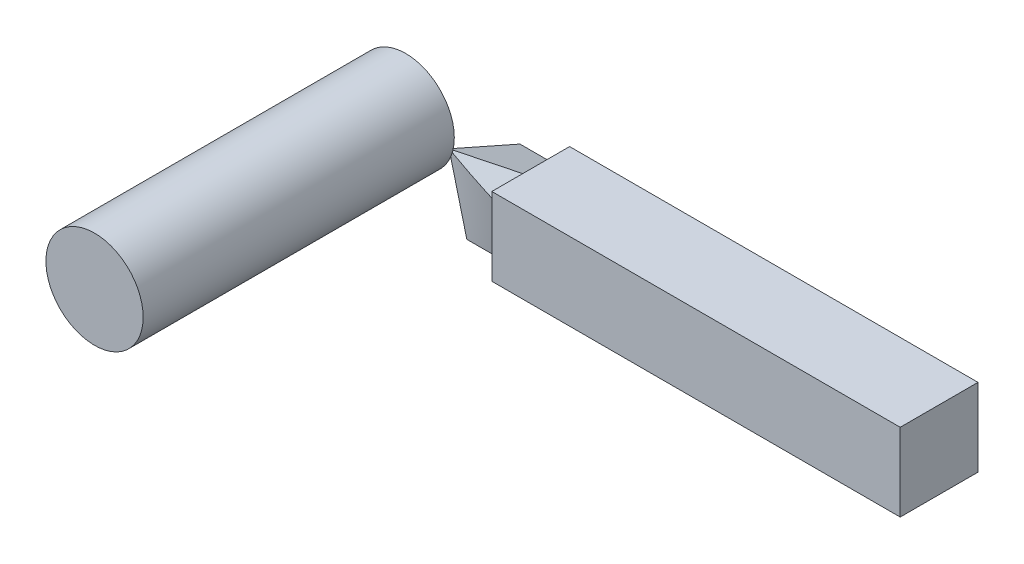
ISO-10303-21;
HEADER;
FILE_DESCRIPTION(('STEP AP214'),'2;1');
FILE_NAME('part.step','',(''),(''),'','','');
FILE_SCHEMA(('AUTOMOTIVE_DESIGN { 1 0 10303 214 1 1 1 1 }'));
ENDSEC;
DATA;
#1=APPLICATION_CONTEXT('core data for automotive mechanical design processes');
#2=APPLICATION_PROTOCOL_DEFINITION('international standard','automotive_design',2000,#1);
#3=PRODUCT_CONTEXT('',#1,'mechanical');
#4=PRODUCT('Part','Part','',(#3));
#5=PRODUCT_RELATED_PRODUCT_CATEGORY('part','',(#4));
#6=PRODUCT_DEFINITION_FORMATION('','',#4);
#7=PRODUCT_DEFINITION_CONTEXT('part definition',#1,'design');
#8=PRODUCT_DEFINITION('design','',#6,#7);
#9=PRODUCT_DEFINITION_SHAPE('','',#8);
#10=(LENGTH_UNIT() NAMED_UNIT(*) SI_UNIT(.MILLI.,.METRE.));
#11=(NAMED_UNIT(*) PLANE_ANGLE_UNIT() SI_UNIT($,.RADIAN.));
#12=(NAMED_UNIT(*) SI_UNIT($,.STERADIAN.) SOLID_ANGLE_UNIT());
#13=UNCERTAINTY_MEASURE_WITH_UNIT(LENGTH_MEASURE(1.E-05),#10,'distance_accuracy_value','');
#14=(GEOMETRIC_REPRESENTATION_CONTEXT(3) GLOBAL_UNCERTAINTY_ASSIGNED_CONTEXT((#13)) GLOBAL_UNIT_ASSIGNED_CONTEXT((#10,
#11,#12)) REPRESENTATION_CONTEXT('',''));
#15=CARTESIAN_POINT('',(0.,0.,0.));
#16=DIRECTION('',(0.,0.,1.));
#17=DIRECTION('',(1.,0.,0.));
#18=AXIS2_PLACEMENT_3D('',#15,#16,#17);
#19=CARTESIAN_POINT('',(-10.5297273001142,13.7765604667373,86.6108000747772));
#20=DIRECTION('',(0.,0.,-1.));
#21=DIRECTION('',(-1.,0.,0.));
#22=AXIS2_PLACEMENT_3D('',#19,#20,#21);
#23=CYLINDRICAL_SURFACE('',#22,12.5);
#24=CARTESIAN_POINT('',(-10.5297273001142,13.7765604667373,86.6108000747772));
#25=DIRECTION('',(0.,0.,1.));
#26=DIRECTION('',(1.,0.,0.));
#27=AXIS2_PLACEMENT_3D('',#24,#25,#26);
#28=CIRCLE('',#27,12.5);
#29=CARTESIAN_POINT('',(1.97027269988581,13.7765604667373,86.6108000747772));
#30=VERTEX_POINT('',#29);
#31=EDGE_CURVE('E12',#30,#30,#28,.T.);
#32=ORIENTED_EDGE('',*,*,#31,.F.);
#33=EDGE_LOOP('',(#32));
#34=FACE_BOUND('',#33,.T.);
#35=CARTESIAN_POINT('',(-10.5297273001142,13.7765604667373,6.61080007477721));
#36=DIRECTION('',(0.,0.,1.));
#37=DIRECTION('',(1.,0.,0.));
#38=AXIS2_PLACEMENT_3D('',#35,#36,#37);
#39=CIRCLE('',#38,12.5);
#40=CARTESIAN_POINT('',(1.97027269988581,13.7765604667373,6.61080007477721));
#41=VERTEX_POINT('',#40);
#42=EDGE_CURVE('E368',#41,#41,#39,.T.);
#43=ORIENTED_EDGE('',*,*,#42,.T.);
#44=EDGE_LOOP('',(#43));
#45=FACE_BOUND('',#44,.T.);
#46=ADVANCED_FACE('F362',(#34,#45),#23,.T.);
#47=CARTESIAN_POINT('',(-10.5297273001142,13.7765604667373,86.6108000747772));
#48=DIRECTION('',(0.,0.,1.));
#49=DIRECTION('',(1.,0.,0.));
#50=AXIS2_PLACEMENT_3D('',#47,#48,#49);
#51=PLANE('',#50);
#52=ORIENTED_EDGE('',*,*,#31,.T.);
#53=EDGE_LOOP('',(#52));
#54=FACE_BOUND('',#53,.T.);
#55=ADVANCED_FACE('F379',(#54),#51,.T.);
#56=CARTESIAN_POINT('',(-10.5297273001142,13.7765604667373,6.61080007477721));
#57=DIRECTION('',(0.,0.,1.));
#58=DIRECTION('',(1.,0.,0.));
#59=AXIS2_PLACEMENT_3D('',#56,#57,#58);
#60=PLANE('',#59);
#61=ORIENTED_EDGE('',*,*,#42,.F.);
#62=EDGE_LOOP('',(#61));
#63=FACE_BOUND('',#62,.T.);
#64=ADVANCED_FACE('F377',(#63),#60,.F.);
#65=CLOSED_SHELL('',(#46,#55,#64));
#66=MANIFOLD_SOLID_BREP('B2',#65);
#67=CARTESIAN_POINT('',(1.71010071662828,9.69846310392957,-14.));
#68=DIRECTION('',(-0.173648177666923,-0.984807753012209,0.));
#69=DIRECTION('',(0.984807753012209,-0.173648177666923,0.));
#70=AXIS2_PLACEMENT_3D('',#67,#68,#69);
#71=PLANE('',#70);
#72=DIRECTION('',(0.888831911434334,-0.156725047300543,-0.430598528521209));
#73=VECTOR('',#72,1.);
#74=CARTESIAN_POINT('',(9.04025358617476,8.405959380311,1.60117150524408));
#75=LINE('',#74,#73);
#76=CARTESIAN_POINT('',(0.244235743587722,9.95693464875209,5.86244103341864));
#77=VERTEX_POINT('',#76);
#78=CARTESIAN_POINT('',(15.,7.35509528937313,-1.28605385552347));
#79=VERTEX_POINT('',#78);
#80=EDGE_CURVE('E413',#77,#79,#75,.T.);
#81=ORIENTED_EDGE('',*,*,#80,.F.);
#82=CARTESIAN_POINT('',(0.890718421846029,9.84294231001449,5.39120845102225));
#83=DIRECTION('',(-0.173648177666923,-0.984807753012209,0.));
#84=DIRECTION('',(-0.984807753012209,0.173648177666923,0.));
#85=AXIS2_PLACEMENT_3D('',#82,#83,#84);
#86=ELLIPSE('',#85,0.812341289508596,0.800000000000001);
#87=CARTESIAN_POINT('',(0.546298910514158,9.90367276254304,6.11327160630295));
#88=VERTEX_POINT('',#87);
#89=EDGE_CURVE('E487',#77,#88,#86,.F.);
#90=ORIENTED_EDGE('',*,*,#89,.T.);
#91=CARTESIAN_POINT('',(0.,10.,5.98076211353315));
#92=CARTESIAN_POINT('',(2.48379016056383,9.5620407802744,6.5858434514635));
#93=CARTESIAN_POINT('',(4.97556164326945,9.12267423811348,7.15711457958157));
#94=CARTESIAN_POINT('',(8.72520560673307,8.46151083930425,7.96046392769599));
#95=CARTESIAN_POINT('',(9.9775290237809,8.24069243230571,8.21940278050777));
#96=CARTESIAN_POINT('',(12.4859982007925,7.79838163612302,8.718885307571));
#97=CARTESIAN_POINT('',(13.7421447021791,7.57688911620603,8.9594251413064));
#98=CARTESIAN_POINT('',(15.,7.35509528937313,9.19048425208671));
#99=B_SPLINE_CURVE_WITH_KNOTS('',3,(#91,#92,#93,#94,#95,#96,#97,#98),.UNSPECIFIED.,.F.,.F.,(4,2,
2,4),(0.,7.78068248414817,11.6737739462897,15.5676758271091),.UNSPECIFIED.);
#100=CARTESIAN_POINT('',(15.,7.35509528937313,9.19048425208671));
#101=VERTEX_POINT('',#100);
#102=EDGE_CURVE('E500',#88,#101,#99,.T.);
#103=ORIENTED_EDGE('',*,*,#102,.T.);
#104=DIRECTION('',(0.,0.,1.));
#105=VECTOR('',#104,1.);
#106=CARTESIAN_POINT('',(15.,7.35509528937313,-14.));
#107=LINE('',#106,#105);
#108=EDGE_CURVE('E575',#79,#101,#107,.T.);
#109=ORIENTED_EDGE('',*,*,#108,.F.);
#110=EDGE_LOOP('',(#81,#90,#103,#109));
#111=FACE_BOUND('',#110,.T.);
#112=ADVANCED_FACE('F407',(#111),#71,.F.);
#113=CARTESIAN_POINT('',(120.,-10.,-10.));
#114=DIRECTION('',(0.,0.,1.));
#115=DIRECTION('',(1.,0.,0.));
#116=AXIS2_PLACEMENT_3D('',#113,#114,#115);
#117=PLANE('',#116);
#118=DIRECTION('',(-1.,0.,0.));
#119=VECTOR('',#118,1.);
#120=CARTESIAN_POINT('',(15.,4.18347826978496,-9.99999999999999));
#121=LINE('',#120,#119);
#122=CARTESIAN_POINT('',(15.,4.183478269785,-9.99999999999999));
#123=VERTEX_POINT('',#122);
#124=CARTESIAN_POINT('',(2.2459496466162,4.18347826978497,-10.));
#125=VERTEX_POINT('',#124);
#126=EDGE_CURVE('E555',#123,#125,#121,.T.);
#127=ORIENTED_EDGE('',*,*,#126,.F.);
#128=DIRECTION('',(0.,-1.,0.));
#129=VECTOR('',#128,1.);
#130=CARTESIAN_POINT('',(15.,-10.,-10.));
#131=LINE('',#130,#129);
#132=CARTESIAN_POINT('',(15.,10.,-9.99999999999999));
#133=VERTEX_POINT('',#132);
#134=EDGE_CURVE('E560',#133,#123,#131,.T.);
#135=ORIENTED_EDGE('',*,*,#134,.F.);
#136=DIRECTION('',(-1.,0.,0.));
#137=VECTOR('',#136,1.);
#138=CARTESIAN_POINT('',(120.,10.,-10.));
#139=LINE('',#138,#137);
#140=CARTESIAN_POINT('',(120.,10.,-10.));
#141=VERTEX_POINT('',#140);
#142=EDGE_CURVE('E515',#141,#133,#139,.T.);
#143=ORIENTED_EDGE('',*,*,#142,.F.);
#144=DIRECTION('',(0.,1.,0.));
#145=VECTOR('',#144,1.);
#146=CARTESIAN_POINT('',(120.,-10.,-10.));
#147=LINE('',#146,#145);
#148=CARTESIAN_POINT('',(120.,-10.,-10.));
#149=VERTEX_POINT('',#148);
#150=EDGE_CURVE('E602',#149,#141,#147,.T.);
#151=ORIENTED_EDGE('',*,*,#150,.F.);
#152=DIRECTION('',(-1.,0.,0.));
#153=VECTOR('',#152,1.);
#154=CARTESIAN_POINT('',(120.,-10.,-10.));
#155=LINE('',#154,#153);
#156=CARTESIAN_POINT('',(2.4556912180581,-9.99999999999999,-9.99999999999999));
#157=VERTEX_POINT('',#156);
#158=EDGE_CURVE('E618',#149,#157,#155,.T.);
#159=ORIENTED_EDGE('',*,*,#158,.T.);
#160=DIRECTION('',(-0.121869343405148,0.992546151641322,0.));
#161=VECTOR('',#160,1.);
#162=CARTESIAN_POINT('',(4.20147537943691,-24.2182709987401,-10.));
#163=LINE('',#162,#161);
#164=CARTESIAN_POINT('',(2.2459496466162,-8.29179198182939,-9.99999999999999));
#165=VERTEX_POINT('',#164);
#166=EDGE_CURVE('E599',#157,#165,#163,.T.);
#167=ORIENTED_EDGE('',*,*,#166,.T.);
#168=DIRECTION('',(0.,1.,0.));
#169=VECTOR('',#168,1.);
#170=CARTESIAN_POINT('',(2.2459496466162,-110.,-10.));
#171=LINE('',#170,#169);
#172=EDGE_CURVE('E561',#165,#125,#171,.T.);
#173=ORIENTED_EDGE('',*,*,#172,.T.);
#174=EDGE_LOOP('',(#127,#135,#143,#151,#159,#167,#173));
#175=FACE_BOUND('',#174,.T.);
#176=ADVANCED_FACE('F412',(#175),#117,.F.);
#177=CARTESIAN_POINT('',(120.,-10.,10.));
#178=DIRECTION('',(0.,1.,0.));
#179=DIRECTION('',(0.,0.,1.));
#180=AXIS2_PLACEMENT_3D('',#177,#178,#179);
#181=PLANE('',#180);
#182=DIRECTION('',(0.,0.,1.));
#183=VECTOR('',#182,1.);
#184=CARTESIAN_POINT('',(2.4556912180581,-9.99999999999999,-110.));
#185=LINE('',#184,#183);
#186=CARTESIAN_POINT('',(2.45569121805811,-10.,3.87867740821986));
#187=VERTEX_POINT('',#186);
#188=EDGE_CURVE('E591',#157,#187,#185,.T.);
#189=ORIENTED_EDGE('',*,*,#188,.F.);
#190=ORIENTED_EDGE('',*,*,#158,.F.);
#191=DIRECTION('',(0.,0.,-1.));
#192=VECTOR('',#191,1.);
#193=CARTESIAN_POINT('',(120.,-10.,10.));
#194=LINE('',#193,#192);
#195=CARTESIAN_POINT('',(120.,-10.,10.));
#196=VERTEX_POINT('',#195);
#197=EDGE_CURVE('E429',#196,#149,#194,.T.);
#198=ORIENTED_EDGE('',*,*,#197,.F.);
#199=DIRECTION('',(-1.,0.,0.));
#200=VECTOR('',#199,1.);
#201=CARTESIAN_POINT('',(120.,-10.,10.));
#202=LINE('',#201,#200);
#203=CARTESIAN_POINT('',(15.,-10.,10.));
#204=VERTEX_POINT('',#203);
#205=EDGE_CURVE('E620',#196,#204,#202,.T.);
#206=ORIENTED_EDGE('',*,*,#205,.T.);
#207=DIRECTION('',(0.,0.,-1.));
#208=VECTOR('',#207,1.);
#209=CARTESIAN_POINT('',(15.,-10.,5.98076211353326));
#210=LINE('',#209,#208);
#211=CARTESIAN_POINT('',(15.,-9.99999999999999,3.87867740821987));
#212=VERTEX_POINT('',#211);
#213=EDGE_CURVE('E621',#204,#212,#210,.T.);
#214=ORIENTED_EDGE('',*,*,#213,.T.);
#215=DIRECTION('',(1.,0.,0.));
#216=VECTOR('',#215,1.);
#217=CARTESIAN_POINT('',(120.,-10.,3.87867740821987));
#218=LINE('',#217,#216);
#219=EDGE_CURVE('E630',#212,#187,#218,.F.);
#220=ORIENTED_EDGE('',*,*,#219,.T.);
#221=EDGE_LOOP('',(#189,#190,#198,#206,#214,#220));
#222=FACE_BOUND('',#221,.T.);
#223=ADVANCED_FACE('F542',(#222),#181,.F.);
#224=CARTESIAN_POINT('',(1.20960947799834,0.148521368620019,-110.));
#225=DIRECTION('',(0.992546151641322,0.121869343405148,0.));
#226=DIRECTION('',(-0.121869343405148,0.992546151641322,0.));
#227=AXIS2_PLACEMENT_3D('',#224,#225,#226);
#228=PLANE('',#227);
#229=DIRECTION('',(0.121211565739221,-0.98718898245743,-0.103757743063883));
#230=VECTOR('',#229,1.);
#231=CARTESIAN_POINT('',(2.65523533984181,-11.6251564554725,3.70786658178036));
#232=LINE('',#231,#230);
#233=CARTESIAN_POINT('',(0.205801296673087,8.32388294456803,5.80459511220634));
#234=VERTEX_POINT('',#233);
#235=EDGE_CURVE('E593',#234,#187,#232,.T.);
#236=ORIENTED_EDGE('',*,*,#235,.F.);
#237=CARTESIAN_POINT('',(0.890718421846022,2.74568060270721,5.39120845102237));
#238=DIRECTION('',(0.992546151641322,0.121869343405148,0.));
#239=DIRECTION('',(-0.121869343405148,0.992546151641322,0.));
#240=AXIS2_PLACEMENT_3D('',#237,#238,#239);
#241=ELLIPSE('',#240,6.56440723850003,0.8);
#242=CARTESIAN_POINT('',(0.0985039668527643,9.19774956942134,5.27986997025431));
#243=VERTEX_POINT('',#242);
#244=EDGE_CURVE('E489',#234,#243,#241,.F.);
#245=ORIENTED_EDGE('',*,*,#244,.T.);
#246=DIRECTION('',(0.0920735116700315,-0.749878575880894,-0.655137077170565));
#247=VECTOR('',#246,1.);
#248=CARTESIAN_POINT('',(8.64603864066889,-60.4163339192617,-55.5389994488492));
#249=LINE('',#248,#247);
#250=EDGE_CURVE('E597',#243,#165,#249,.T.);
#251=ORIENTED_EDGE('',*,*,#250,.T.);
#252=ORIENTED_EDGE('',*,*,#166,.F.);
#253=ORIENTED_EDGE('',*,*,#188,.T.);
#254=EDGE_LOOP('',(#236,#245,#251,#252,#253));
#255=FACE_BOUND('',#254,.T.);
#256=ADVANCED_FACE('F547',(#255),#228,.F.);
#257=CARTESIAN_POINT('',(0.890718421846022,-18.,5.39120845102237));
#258=DIRECTION('',(0.,1.,0.));
#259=DIRECTION('',(0.,0.,1.));
#260=AXIS2_PLACEMENT_3D('',#257,#258,#259);
#261=CYLINDRICAL_SURFACE('',#260,0.8);
#262=ORIENTED_EDGE('',*,*,#244,.F.);
#263=CARTESIAN_POINT('',(0.205801296673087,8.32388294456798,5.80459511220623));
#264=CARTESIAN_POINT('',(0.210413084149111,8.37173481120572,5.81223494159052));
#265=CARTESIAN_POINT('',(0.215237109390485,8.41955520371719,5.81994059987371));
#266=CARTESIAN_POINT('',(0.225367324244377,8.51512383322109,5.8354988960342));
#267=CARTESIAN_POINT('',(0.230673542900525,8.5628720656908,5.84335154274231));
#268=CARTESIAN_POINT('',(0.247409501021539,8.70605737663696,5.86716341859697));
#269=CARTESIAN_POINT('',(0.259649820223377,8.80136349352369,5.88336520648307));
#270=CARTESIAN_POINT('',(0.282644512578619,8.96091208313898,5.91126462272347));
#271=CARTESIAN_POINT('',(0.292614810357071,9.02530644936148,5.92273881432036));
#272=CARTESIAN_POINT('',(0.314274578003356,9.15370938424389,5.94615785015179));
#273=CARTESIAN_POINT('',(0.325963607882506,9.21771804728967,5.95810257336085));
#274=CARTESIAN_POINT('',(0.347602032849032,9.32494180466321,5.97872070407494));
#275=CARTESIAN_POINT('',(0.356927550047339,9.36831376999397,5.9872302567712));
#276=CARTESIAN_POINT('',(0.376985124929487,9.45465740447111,6.00460515080651));
#277=CARTESIAN_POINT('',(0.387716899781651,9.49762915225425,6.0134704203544));
#278=CARTESIAN_POINT('',(0.407457430798417,9.56965383078062,6.02883068393462));
#279=CARTESIAN_POINT('',(0.415960746819172,9.59887067203438,6.03520327300336));
#280=CARTESIAN_POINT('',(0.434140864566578,9.65685522668753,6.04821888791853));
#281=CARTESIAN_POINT('',(0.443816670542344,9.68562329809349,6.05486168114931));
#282=CARTESIAN_POINT('',(0.461585996500953,9.73383254663159,6.06642746030114));
#283=CARTESIAN_POINT('',(0.469264605418846,9.75344718992353,6.07125843593711));
#284=CARTESIAN_POINT('',(0.485650852906234,9.79223905508384,6.08114474349292));
#285=CARTESIAN_POINT('',(0.494360633873555,9.81141526388333,6.08620052838751));
#286=CARTESIAN_POINT('',(0.513823204026937,9.8503885636021,6.09695925931494));
#287=CARTESIAN_POINT('',(0.524677819410076,9.87013127021928,6.10268260381538));
#288=CARTESIAN_POINT('',(0.542683151362726,9.89852915132423,6.11156615881562));
#289=CARTESIAN_POINT('',(0.548959590914308,9.90777717715757,6.11457154097687));
#290=CARTESIAN_POINT('',(0.562235712815918,9.92569276506621,6.12069644744344));
#291=CARTESIAN_POINT('',(0.569235715951094,9.93436006685205,6.12381602197562));
#292=CARTESIAN_POINT('',(0.588677014099394,9.95585316458875,6.13211464525557));
#293=CARTESIAN_POINT('',(0.601861145976829,9.96804974405277,6.13740522950877));
#294=CARTESIAN_POINT('',(0.622830531428491,9.98208238612616,6.14505140284252));
#295=CARTESIAN_POINT('',(0.629340063734289,9.98583530636458,6.14733861257557));
#296=CARTESIAN_POINT('',(0.642900001159228,9.99217537046395,6.15189028909175));
#297=CARTESIAN_POINT('',(0.64994813992659,9.99476711490889,6.15415481024162));
#298=CARTESIAN_POINT('',(0.661492093698383,9.9977277338463,6.1576779125852));
#299=CARTESIAN_POINT('',(0.66585751011964,9.99857205535572,6.15897035458095));
#300=CARTESIAN_POINT('',(0.674697290223388,9.99971193970374,6.16150474761336));
#301=CARTESIAN_POINT('',(0.67917209104241,10.0000047245149,6.16274641238966));
#302=CARTESIAN_POINT('',(0.683663185763669,10.,6.16394911205342));
#303=B_SPLINE_CURVE_WITH_KNOTS('',3,(#263,#264,#265,#266,#267,#268,#269,#270,#271,#272,#273,
#274,#275,#276,#277,#278,#279,#280,#281,#282,#283,#284,#285,#286,#287,#288,#289,#290,#291,#292,
#293,#294,#295,#296,#297,#298,#299,#300,#301,#302),.UNSPECIFIED.,.F.,.F.,(4,2,2,2,2,2,2,2,2,2,2,
2,2,2,2,2,2,2,2,4),(0.,0.146028715120229,0.29206623172685,0.584359578899613,0.782835508191702,
0.981260716598987,1.1167598373421,1.25223174771562,1.34548144950654,1.43865250572127,
1.50346218576654,1.5684089609339,1.63802213118835,1.67270664553417,1.70740660342978,
1.76294921980601,1.78643529313741,1.80982747335104,1.82368673171861,1.83761561284954),.UNSPECIFIED.);
#304=EDGE_CURVE('E361',#234,#88,#303,.T.);
#305=ORIENTED_EDGE('',*,*,#304,.T.);
#306=ORIENTED_EDGE('',*,*,#89,.F.);
#307=CARTESIAN_POINT('',(0.890718421846022,9.78542001534341,5.39120845102237));
#308=DIRECTION('',(0.,-0.939692620785911,0.342020143325663));
#309=DIRECTION('',(0.,0.342020143325663,0.939692620785911));
#310=AXIS2_PLACEMENT_3D('',#307,#308,#309);
#311=ELLIPSE('',#310,0.851342217980728,0.8);
#312=CARTESIAN_POINT('',(0.0985039668527643,9.74489612241542,5.27986997025431));
#313=VERTEX_POINT('',#312);
#314=EDGE_CURVE('E510',#313,#77,#311,.F.);
#315=ORIENTED_EDGE('',*,*,#314,.F.);
#316=DIRECTION('',(0.,1.,0.));
#317=VECTOR('',#316,1.);
#318=CARTESIAN_POINT('',(0.0985039668527643,-18.,5.27986997025431));
#319=LINE('',#318,#317);
#320=EDGE_CURVE('E589',#243,#313,#319,.T.);
#321=ORIENTED_EDGE('',*,*,#320,.F.);
#322=EDGE_LOOP('',(#262,#305,#306,#315,#321));
#323=FACE_BOUND('',#322,.T.);
#324=ADVANCED_FACE('F488',(#323),#261,.T.);
#325=CARTESIAN_POINT('',(0.824260727372357,-110.,0.115842290637306));
#326=DIRECTION('',(-0.990268068741571,0.,-0.139173100960058));
#327=DIRECTION('',(-0.139173100960058,0.,0.990268068741571));
#328=AXIS2_PLACEMENT_3D('',#325,#326,#327);
#329=PLANE('',#328);
#330=ORIENTED_EDGE('',*,*,#250,.F.);
#331=ORIENTED_EDGE('',*,*,#320,.T.);
#332=DIRECTION('',(-0.130928346226655,0.339075977093174,0.931603590543028));
#333=VECTOR('',#332,1.);
#334=CARTESIAN_POINT('',(6.05685222697823,-5.68593162718414,-37.1159808352652));
#335=LINE('',#334,#333);
#336=EDGE_CURVE('E566',#125,#313,#335,.T.);
#337=ORIENTED_EDGE('',*,*,#336,.F.);
#338=ORIENTED_EDGE('',*,*,#172,.F.);
#339=EDGE_LOOP('',(#330,#331,#337,#338));
#340=FACE_BOUND('',#339,.T.);
#341=ADVANCED_FACE('F666',(#340),#329,.T.);
#342=CARTESIAN_POINT('',(120.,-10.,10.));
#343=DIRECTION('',(0.,0.,-1.));
#344=DIRECTION('',(-1.,0.,0.));
#345=AXIS2_PLACEMENT_3D('',#342,#343,#344);
#346=PLANE('',#345);
#347=DIRECTION('',(0.,1.,0.));
#348=VECTOR('',#347,1.);
#349=CARTESIAN_POINT('',(15.,-110.,10.));
#350=LINE('',#349,#348);
#351=CARTESIAN_POINT('',(15.,10.,10.));
#352=VERTEX_POINT('',#351);
#353=EDGE_CURVE('E601',#204,#352,#350,.T.);
#354=ORIENTED_EDGE('',*,*,#353,.F.);
#355=ORIENTED_EDGE('',*,*,#205,.F.);
#356=DIRECTION('',(0.,-1.,0.));
#357=VECTOR('',#356,1.);
#358=CARTESIAN_POINT('',(120.,-10.,10.));
#359=LINE('',#358,#357);
#360=CARTESIAN_POINT('',(120.,10.,10.));
#361=VERTEX_POINT('',#360);
#362=EDGE_CURVE('E613',#361,#196,#359,.T.);
#363=ORIENTED_EDGE('',*,*,#362,.F.);
#364=DIRECTION('',(-1.,0.,0.));
#365=VECTOR('',#364,1.);
#366=CARTESIAN_POINT('',(120.,10.,10.));
#367=LINE('',#366,#365);
#368=EDGE_CURVE('E644',#361,#352,#367,.T.);
#369=ORIENTED_EDGE('',*,*,#368,.T.);
#370=EDGE_LOOP('',(#354,#355,#363,#369));
#371=FACE_BOUND('',#370,.T.);
#372=ADVANCED_FACE('F668',(#371),#346,.F.);
#373=CARTESIAN_POINT('',(120.,10.,10.));
#374=DIRECTION('',(0.,-1.,0.));
#375=DIRECTION('',(0.,0.,-1.));
#376=AXIS2_PLACEMENT_3D('',#373,#374,#375);
#377=PLANE('',#376);
#378=ORIENTED_EDGE('',*,*,#142,.T.);
#379=DIRECTION('',(0.,0.,1.));
#380=VECTOR('',#379,1.);
#381=CARTESIAN_POINT('',(15.,10.,-14.));
#382=LINE('',#381,#380);
#383=EDGE_CURVE('E577',#133,#352,#382,.T.);
#384=ORIENTED_EDGE('',*,*,#383,.T.);
#385=ORIENTED_EDGE('',*,*,#368,.F.);
#386=DIRECTION('',(0.,0.,1.));
#387=VECTOR('',#386,1.);
#388=CARTESIAN_POINT('',(120.,10.,10.));
#389=LINE('',#388,#387);
#390=EDGE_CURVE('E609',#141,#361,#389,.T.);
#391=ORIENTED_EDGE('',*,*,#390,.F.);
#392=EDGE_LOOP('',(#378,#384,#385,#391));
#393=FACE_BOUND('',#392,.T.);
#394=ADVANCED_FACE('F679',(#393),#377,.F.);
#395=CARTESIAN_POINT('',(120.,0.,0.));
#396=DIRECTION('',(-1.,0.,0.));
#397=DIRECTION('',(0.,0.,1.));
#398=AXIS2_PLACEMENT_3D('',#395,#396,#397);
#399=PLANE('',#398);
#400=ORIENTED_EDGE('',*,*,#150,.T.);
#401=ORIENTED_EDGE('',*,*,#390,.T.);
#402=ORIENTED_EDGE('',*,*,#362,.T.);
#403=ORIENTED_EDGE('',*,*,#197,.T.);
#404=EDGE_LOOP('',(#400,#401,#402,#403));
#405=FACE_BOUND('',#404,.T.);
#406=ADVANCED_FACE('F685',(#405),#399,.F.);
#407=CARTESIAN_POINT('',(15.,0.,-110.));
#408=DIRECTION('',(-1.,0.,0.));
#409=DIRECTION('',(0.,0.,1.));
#410=AXIS2_PLACEMENT_3D('',#407,#408,#409);
#411=PLANE('',#410);
#412=ORIENTED_EDGE('',*,*,#134,.T.);
#413=DIRECTION('',(0.,-0.342020143325663,-0.939692620785911));
#414=VECTOR('',#413,1.);
#415=CARTESIAN_POINT('',(15.,4.183478269785,-9.99999999999999));
#416=LINE('',#415,#414);
#417=EDGE_CURVE('E499',#79,#123,#416,.T.);
#418=ORIENTED_EDGE('',*,*,#417,.F.);
#419=ORIENTED_EDGE('',*,*,#108,.T.);
#420=DIRECTION('',(0.,-0.956215027462806,-0.292665032510386));
#421=VECTOR('',#420,1.);
#422=CARTESIAN_POINT('',(15.,10.,10.));
#423=LINE('',#422,#421);
#424=EDGE_CURVE('E504',#101,#212,#423,.T.);
#425=ORIENTED_EDGE('',*,*,#424,.T.);
#426=ORIENTED_EDGE('',*,*,#213,.F.);
#427=ORIENTED_EDGE('',*,*,#353,.T.);
#428=ORIENTED_EDGE('',*,*,#383,.F.);
#429=EDGE_LOOP('',(#412,#418,#419,#425,#426,#427,#428));
#430=FACE_BOUND('',#429,.T.);
#431=ADVANCED_FACE('F688',(#430),#411,.T.);
#432=CARTESIAN_POINT('',(15.,6.90804232406403,-2.51432178301038));
#433=DIRECTION('',(0.,-0.939692620785911,0.342020143325663));
#434=DIRECTION('',(0.,-0.342020143325663,-0.939692620785911));
#435=AXIS2_PLACEMENT_3D('',#432,#433,#434);
#436=PLANE('',#435);
#437=ORIENTED_EDGE('',*,*,#314,.T.);
#438=ORIENTED_EDGE('',*,*,#80,.T.);
#439=ORIENTED_EDGE('',*,*,#417,.T.);
#440=ORIENTED_EDGE('',*,*,#126,.T.);
#441=ORIENTED_EDGE('',*,*,#336,.T.);
#442=EDGE_LOOP('',(#437,#438,#439,#440,#441));
#443=FACE_BOUND('',#442,.T.);
#444=ADVANCED_FACE('F567',(#443),#436,.F.);
#445=CARTESIAN_POINT('',(15.,10.,10.));
#446=CARTESIAN_POINT('',(15.,-10.,3.87867740821987));
#447=CARTESIAN_POINT('',(12.5,10.,9.3301270189222));
#448=CARTESIAN_POINT('',(12.9092818696764,-10.,3.87867740821987));
#449=CARTESIAN_POINT('',(10.,10.,8.66025403784439));
#450=CARTESIAN_POINT('',(10.8185637393527,-10.,3.87867740821987));
#451=CARTESIAN_POINT('',(5.00000000000002,10.,7.32050807568877));
#452=CARTESIAN_POINT('',(6.63712747870541,-10.,3.87867740821987));
#453=CARTESIAN_POINT('',(2.50000000000001,10.,6.65063509461096));
#454=CARTESIAN_POINT('',(4.54640934838176,-10.,3.87867740821987));
#455=CARTESIAN_POINT('',(0.,10.,5.98076211353315));
#456=CARTESIAN_POINT('',(2.45569121805811,-10.,3.87867740821987));
#457=B_SPLINE_SURFACE_WITH_KNOTS('',3,1,((#445,#446),(#447,#448),(#449,#450),(#451,#452),(#453,
#454),(#455,#456)),.UNSPECIFIED.,.F.,.F.,.F.,(4,2,4),(2,2),(0.,0.5,1.),(0.,1.),.UNSPECIFIED.);
#458=ORIENTED_EDGE('',*,*,#304,.F.);
#459=ORIENTED_EDGE('',*,*,#235,.T.);
#460=ORIENTED_EDGE('',*,*,#219,.F.);
#461=ORIENTED_EDGE('',*,*,#424,.F.);
#462=ORIENTED_EDGE('',*,*,#102,.F.);
#463=EDGE_LOOP('',(#458,#459,#460,#461,#462));
#464=FACE_BOUND('',#463,.T.);
#465=ADVANCED_FACE('F503',(#464),#457,.T.);
#466=CLOSED_SHELL('',(#112,#176,#223,#256,#324,#341,#372,#394,#406,#431,#444,#465));
#467=MANIFOLD_SOLID_BREP('B7',#466);
#468=ADVANCED_BREP_SHAPE_REPRESENTATION('',(#18,#66,#467),#14);
#469=SHAPE_DEFINITION_REPRESENTATION(#9,#468);
ENDSEC;
END-ISO-10303-21;
